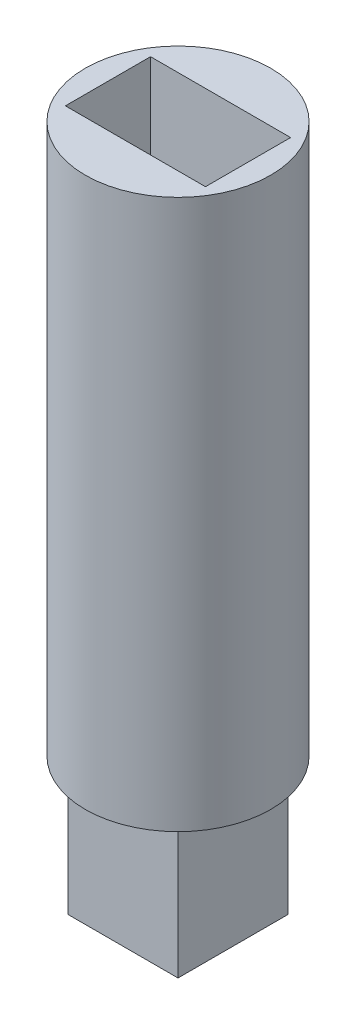
ISO-10303-21;
HEADER;
FILE_DESCRIPTION(('STEP AP214'),'2;1');
FILE_NAME('part.step','',(''),(''),'','','');
FILE_SCHEMA(('AUTOMOTIVE_DESIGN { 1 0 10303 214 1 1 1 1 }'));
ENDSEC;
DATA;
#1=APPLICATION_CONTEXT('core data for automotive mechanical design processes');
#2=APPLICATION_PROTOCOL_DEFINITION('international standard','automotive_design',2000,#1);
#3=PRODUCT_CONTEXT('',#1,'mechanical');
#4=PRODUCT('Part','Part','',(#3));
#5=PRODUCT_RELATED_PRODUCT_CATEGORY('part','',(#4));
#6=PRODUCT_DEFINITION_FORMATION('','',#4);
#7=PRODUCT_DEFINITION_CONTEXT('part definition',#1,'design');
#8=PRODUCT_DEFINITION('design','',#6,#7);
#9=PRODUCT_DEFINITION_SHAPE('','',#8);
#10=(LENGTH_UNIT() NAMED_UNIT(*) SI_UNIT(.MILLI.,.METRE.));
#11=(NAMED_UNIT(*) PLANE_ANGLE_UNIT() SI_UNIT($,.RADIAN.));
#12=(NAMED_UNIT(*) SI_UNIT($,.STERADIAN.) SOLID_ANGLE_UNIT());
#13=UNCERTAINTY_MEASURE_WITH_UNIT(LENGTH_MEASURE(1.E-05),#10,'distance_accuracy_value','');
#14=(GEOMETRIC_REPRESENTATION_CONTEXT(3) GLOBAL_UNCERTAINTY_ASSIGNED_CONTEXT((#13)) GLOBAL_UNIT_ASSIGNED_CONTEXT((#10,
#11,#12)) REPRESENTATION_CONTEXT('',''));
#15=CARTESIAN_POINT('',(0.,0.,0.));
#16=DIRECTION('',(0.,0.,1.));
#17=DIRECTION('',(1.,0.,0.));
#18=AXIS2_PLACEMENT_3D('',#15,#16,#17);
#19=CARTESIAN_POINT('',(0.,0.,0.));
#20=DIRECTION('',(0.,1.,0.));
#21=DIRECTION('',(0.,0.,1.));
#22=AXIS2_PLACEMENT_3D('',#19,#20,#21);
#23=PLANE('',#22);
#24=CARTESIAN_POINT('',(0.,0.,0.));
#25=DIRECTION('',(0.,1.,0.));
#26=DIRECTION('',(0.,0.,1.));
#27=AXIS2_PLACEMENT_3D('',#24,#25,#26);
#28=CIRCLE('',#27,3.375);
#29=CARTESIAN_POINT('',(0.,0.,3.375));
#30=VERTEX_POINT('',#29);
#31=EDGE_CURVE('E43',#30,#30,#28,.T.);
#32=ORIENTED_EDGE('',*,*,#31,.F.);
#33=EDGE_LOOP('',(#32));
#34=FACE_BOUND('',#33,.T.);
#35=DIRECTION('',(0.,0.,1.));
#36=VECTOR('',#35,1.);
#37=CARTESIAN_POINT('',(2.,0.,2.));
#38=LINE('',#37,#36);
#39=CARTESIAN_POINT('',(2.,0.,-2.));
#40=VERTEX_POINT('',#39);
#41=CARTESIAN_POINT('',(2.,0.,2.));
#42=VERTEX_POINT('',#41);
#43=EDGE_CURVE('E54',#40,#42,#38,.T.);
#44=ORIENTED_EDGE('',*,*,#43,.F.);
#45=DIRECTION('',(1.,0.,0.));
#46=VECTOR('',#45,1.);
#47=CARTESIAN_POINT('',(-2.,0.,-2.));
#48=LINE('',#47,#46);
#49=CARTESIAN_POINT('',(-2.,0.,-2.));
#50=VERTEX_POINT('',#49);
#51=EDGE_CURVE('E58',#50,#40,#48,.T.);
#52=ORIENTED_EDGE('',*,*,#51,.F.);
#53=DIRECTION('',(0.,0.,-1.));
#54=VECTOR('',#53,1.);
#55=CARTESIAN_POINT('',(-2.,0.,2.));
#56=LINE('',#55,#54);
#57=CARTESIAN_POINT('',(-2.,0.,2.));
#58=VERTEX_POINT('',#57);
#59=EDGE_CURVE('E267',#58,#50,#56,.T.);
#60=ORIENTED_EDGE('',*,*,#59,.F.);
#61=DIRECTION('',(-1.,0.,0.));
#62=VECTOR('',#61,1.);
#63=CARTESIAN_POINT('',(-2.,0.,2.));
#64=LINE('',#63,#62);
#65=EDGE_CURVE('E273',#42,#58,#64,.T.);
#66=ORIENTED_EDGE('',*,*,#65,.F.);
#67=EDGE_LOOP('',(#44,#52,#60,#66));
#68=FACE_BOUND('',#67,.T.);
#69=ADVANCED_FACE('F39',(#34,#68),#23,.F.);
#70=CARTESIAN_POINT('',(0.,20.,0.));
#71=DIRECTION('',(0.,-1.,0.));
#72=DIRECTION('',(0.,0.,-1.));
#73=AXIS2_PLACEMENT_3D('',#70,#71,#72);
#74=CYLINDRICAL_SURFACE('',#73,3.375);
#75=CARTESIAN_POINT('',(0.,20.,0.));
#76=DIRECTION('',(0.,1.,0.));
#77=DIRECTION('',(0.,0.,1.));
#78=AXIS2_PLACEMENT_3D('',#75,#76,#77);
#79=CIRCLE('',#78,3.375);
#80=CARTESIAN_POINT('',(0.,20.,3.375));
#81=VERTEX_POINT('',#80);
#82=EDGE_CURVE('E11',#81,#81,#79,.T.);
#83=ORIENTED_EDGE('',*,*,#82,.F.);
#84=EDGE_LOOP('',(#83));
#85=FACE_BOUND('',#84,.T.);
#86=ORIENTED_EDGE('',*,*,#31,.T.);
#87=EDGE_LOOP('',(#86));
#88=FACE_BOUND('',#87,.T.);
#89=ADVANCED_FACE('F41',(#85,#88),#74,.T.);
#90=CARTESIAN_POINT('',(0.,20.,0.));
#91=DIRECTION('',(0.,1.,0.));
#92=DIRECTION('',(0.,0.,1.));
#93=AXIS2_PLACEMENT_3D('',#90,#91,#92);
#94=PLANE('',#93);
#95=DIRECTION('',(0.,0.,-1.));
#96=VECTOR('',#95,1.);
#97=CARTESIAN_POINT('',(2.55,20.,-1.55));
#98=LINE('',#97,#96);
#99=CARTESIAN_POINT('',(2.55,20.,1.55));
#100=VERTEX_POINT('',#99);
#101=CARTESIAN_POINT('',(2.55,20.,-1.55));
#102=VERTEX_POINT('',#101);
#103=EDGE_CURVE('E124',#100,#102,#98,.T.);
#104=ORIENTED_EDGE('',*,*,#103,.F.);
#105=DIRECTION('',(1.,0.,0.));
#106=VECTOR('',#105,1.);
#107=CARTESIAN_POINT('',(-2.55,20.,1.55));
#108=LINE('',#107,#106);
#109=CARTESIAN_POINT('',(-2.55,20.,1.55));
#110=VERTEX_POINT('',#109);
#111=EDGE_CURVE('E136',#110,#100,#108,.T.);
#112=ORIENTED_EDGE('',*,*,#111,.F.);
#113=DIRECTION('',(0.,0.,1.));
#114=VECTOR('',#113,1.);
#115=CARTESIAN_POINT('',(-2.55,20.,-1.55));
#116=LINE('',#115,#114);
#117=CARTESIAN_POINT('',(-2.55,20.,-1.55));
#118=VERTEX_POINT('',#117);
#119=EDGE_CURVE('E148',#118,#110,#116,.T.);
#120=ORIENTED_EDGE('',*,*,#119,.F.);
#121=DIRECTION('',(-1.,0.,0.));
#122=VECTOR('',#121,1.);
#123=CARTESIAN_POINT('',(-2.55,20.,-1.55));
#124=LINE('',#123,#122);
#125=EDGE_CURVE('E126',#102,#118,#124,.T.);
#126=ORIENTED_EDGE('',*,*,#125,.F.);
#127=EDGE_LOOP('',(#104,#112,#120,#126));
#128=FACE_BOUND('',#127,.T.);
#129=ORIENTED_EDGE('',*,*,#82,.T.);
#130=EDGE_LOOP('',(#129));
#131=FACE_BOUND('',#130,.T.);
#132=ADVANCED_FACE('F169',(#128,#131),#94,.T.);
#133=CARTESIAN_POINT('',(2.55,14.,-1.55));
#134=DIRECTION('',(1.,0.,0.));
#135=DIRECTION('',(0.,0.,-1.));
#136=AXIS2_PLACEMENT_3D('',#133,#134,#135);
#137=PLANE('',#136);
#138=ORIENTED_EDGE('',*,*,#103,.T.);
#139=DIRECTION('',(0.,1.,0.));
#140=VECTOR('',#139,1.);
#141=CARTESIAN_POINT('',(2.55,14.,-1.55));
#142=LINE('',#141,#140);
#143=CARTESIAN_POINT('',(2.55,14.,-1.55));
#144=VERTEX_POINT('',#143);
#145=EDGE_CURVE('E144',#144,#102,#142,.T.);
#146=ORIENTED_EDGE('',*,*,#145,.F.);
#147=DIRECTION('',(0.,0.,-1.));
#148=VECTOR('',#147,1.);
#149=CARTESIAN_POINT('',(2.55,14.,-1.55));
#150=LINE('',#149,#148);
#151=CARTESIAN_POINT('',(2.55,14.,1.55));
#152=VERTEX_POINT('',#151);
#153=EDGE_CURVE('E132',#152,#144,#150,.T.);
#154=ORIENTED_EDGE('',*,*,#153,.F.);
#155=DIRECTION('',(0.,1.,0.));
#156=VECTOR('',#155,1.);
#157=CARTESIAN_POINT('',(2.55,14.,1.55));
#158=LINE('',#157,#156);
#159=EDGE_CURVE('E153',#152,#100,#158,.T.);
#160=ORIENTED_EDGE('',*,*,#159,.T.);
#161=EDGE_LOOP('',(#138,#146,#154,#160));
#162=FACE_BOUND('',#161,.T.);
#163=ADVANCED_FACE('F178',(#162),#137,.F.);
#164=CARTESIAN_POINT('',(-2.55,14.,1.55));
#165=DIRECTION('',(0.,0.,1.));
#166=DIRECTION('',(1.,0.,0.));
#167=AXIS2_PLACEMENT_3D('',#164,#165,#166);
#168=PLANE('',#167);
#169=ORIENTED_EDGE('',*,*,#111,.T.);
#170=ORIENTED_EDGE('',*,*,#159,.F.);
#171=DIRECTION('',(1.,0.,0.));
#172=VECTOR('',#171,1.);
#173=CARTESIAN_POINT('',(-2.55,14.,1.55));
#174=LINE('',#173,#172);
#175=CARTESIAN_POINT('',(-2.55,14.,1.55));
#176=VERTEX_POINT('',#175);
#177=EDGE_CURVE('E142',#176,#152,#174,.T.);
#178=ORIENTED_EDGE('',*,*,#177,.F.);
#179=DIRECTION('',(0.,1.,0.));
#180=VECTOR('',#179,1.);
#181=CARTESIAN_POINT('',(-2.55,14.,1.55));
#182=LINE('',#181,#180);
#183=EDGE_CURVE('E155',#176,#110,#182,.T.);
#184=ORIENTED_EDGE('',*,*,#183,.T.);
#185=EDGE_LOOP('',(#169,#170,#178,#184));
#186=FACE_BOUND('',#185,.T.);
#187=ADVANCED_FACE('F180',(#186),#168,.F.);
#188=CARTESIAN_POINT('',(-2.55,14.,-1.55));
#189=DIRECTION('',(-1.,0.,0.));
#190=DIRECTION('',(0.,0.,1.));
#191=AXIS2_PLACEMENT_3D('',#188,#189,#190);
#192=PLANE('',#191);
#193=ORIENTED_EDGE('',*,*,#119,.T.);
#194=ORIENTED_EDGE('',*,*,#183,.F.);
#195=DIRECTION('',(0.,0.,1.));
#196=VECTOR('',#195,1.);
#197=CARTESIAN_POINT('',(-2.55,14.,-1.55));
#198=LINE('',#197,#196);
#199=CARTESIAN_POINT('',(-2.55,14.,-1.55));
#200=VERTEX_POINT('',#199);
#201=EDGE_CURVE('E139',#200,#176,#198,.T.);
#202=ORIENTED_EDGE('',*,*,#201,.F.);
#203=DIRECTION('',(0.,1.,0.));
#204=VECTOR('',#203,1.);
#205=CARTESIAN_POINT('',(-2.55,14.,-1.55));
#206=LINE('',#205,#204);
#207=EDGE_CURVE('E157',#200,#118,#206,.T.);
#208=ORIENTED_EDGE('',*,*,#207,.T.);
#209=EDGE_LOOP('',(#193,#194,#202,#208));
#210=FACE_BOUND('',#209,.T.);
#211=ADVANCED_FACE('F173',(#210),#192,.F.);
#212=CARTESIAN_POINT('',(-2.55,14.,-1.55));
#213=DIRECTION('',(0.,0.,-1.));
#214=DIRECTION('',(-1.,0.,0.));
#215=AXIS2_PLACEMENT_3D('',#212,#213,#214);
#216=PLANE('',#215);
#217=ORIENTED_EDGE('',*,*,#125,.T.);
#218=ORIENTED_EDGE('',*,*,#207,.F.);
#219=DIRECTION('',(-1.,0.,0.));
#220=VECTOR('',#219,1.);
#221=CARTESIAN_POINT('',(-2.55,14.,-1.55));
#222=LINE('',#221,#220);
#223=EDGE_CURVE('E135',#144,#200,#222,.T.);
#224=ORIENTED_EDGE('',*,*,#223,.F.);
#225=ORIENTED_EDGE('',*,*,#145,.T.);
#226=EDGE_LOOP('',(#217,#218,#224,#225));
#227=FACE_BOUND('',#226,.T.);
#228=ADVANCED_FACE('F163',(#227),#216,.F.);
#229=CARTESIAN_POINT('',(0.,14.,0.));
#230=DIRECTION('',(0.,1.,0.));
#231=DIRECTION('',(0.,0.,1.));
#232=AXIS2_PLACEMENT_3D('',#229,#230,#231);
#233=PLANE('',#232);
#234=ORIENTED_EDGE('',*,*,#153,.T.);
#235=ORIENTED_EDGE('',*,*,#223,.T.);
#236=ORIENTED_EDGE('',*,*,#201,.T.);
#237=ORIENTED_EDGE('',*,*,#177,.T.);
#238=EDGE_LOOP('',(#234,#235,#236,#237));
#239=FACE_BOUND('',#238,.T.);
#240=ADVANCED_FACE('F177',(#239),#233,.T.);
#241=CARTESIAN_POINT('',(2.,-5.,2.));
#242=DIRECTION('',(-1.,0.,0.));
#243=DIRECTION('',(0.,0.,1.));
#244=AXIS2_PLACEMENT_3D('',#241,#242,#243);
#245=PLANE('',#244);
#246=ORIENTED_EDGE('',*,*,#43,.T.);
#247=DIRECTION('',(0.,1.,0.));
#248=VECTOR('',#247,1.);
#249=CARTESIAN_POINT('',(2.,-5.,2.));
#250=LINE('',#249,#248);
#251=CARTESIAN_POINT('',(2.,-5.,2.));
#252=VERTEX_POINT('',#251);
#253=EDGE_CURVE('E107',#252,#42,#250,.T.);
#254=ORIENTED_EDGE('',*,*,#253,.F.);
#255=DIRECTION('',(0.,0.,1.));
#256=VECTOR('',#255,1.);
#257=CARTESIAN_POINT('',(2.,-5.,2.));
#258=LINE('',#257,#256);
#259=CARTESIAN_POINT('',(2.,-5.,-2.));
#260=VERTEX_POINT('',#259);
#261=EDGE_CURVE('E113',#260,#252,#258,.T.);
#262=ORIENTED_EDGE('',*,*,#261,.F.);
#263=DIRECTION('',(0.,1.,0.));
#264=VECTOR('',#263,1.);
#265=CARTESIAN_POINT('',(2.,-5.,-2.));
#266=LINE('',#265,#264);
#267=EDGE_CURVE('E265',#260,#40,#266,.T.);
#268=ORIENTED_EDGE('',*,*,#267,.T.);
#269=EDGE_LOOP('',(#246,#254,#262,#268));
#270=FACE_BOUND('',#269,.T.);
#271=ADVANCED_FACE('F123',(#270),#245,.F.);
#272=CARTESIAN_POINT('',(-2.,-5.,2.));
#273=DIRECTION('',(0.,0.,-1.));
#274=DIRECTION('',(-1.,0.,0.));
#275=AXIS2_PLACEMENT_3D('',#272,#273,#274);
#276=PLANE('',#275);
#277=ORIENTED_EDGE('',*,*,#65,.T.);
#278=DIRECTION('',(0.,1.,0.));
#279=VECTOR('',#278,1.);
#280=CARTESIAN_POINT('',(-2.,-5.,2.));
#281=LINE('',#280,#279);
#282=CARTESIAN_POINT('',(-2.,-5.,2.));
#283=VERTEX_POINT('',#282);
#284=EDGE_CURVE('E109',#283,#58,#281,.T.);
#285=ORIENTED_EDGE('',*,*,#284,.F.);
#286=DIRECTION('',(-1.,0.,0.));
#287=VECTOR('',#286,1.);
#288=CARTESIAN_POINT('',(-2.,-5.,2.));
#289=LINE('',#288,#287);
#290=EDGE_CURVE('E102',#252,#283,#289,.T.);
#291=ORIENTED_EDGE('',*,*,#290,.F.);
#292=ORIENTED_EDGE('',*,*,#253,.T.);
#293=EDGE_LOOP('',(#277,#285,#291,#292));
#294=FACE_BOUND('',#293,.T.);
#295=ADVANCED_FACE('F105',(#294),#276,.F.);
#296=CARTESIAN_POINT('',(-2.,-5.,2.));
#297=DIRECTION('',(1.,0.,0.));
#298=DIRECTION('',(0.,0.,-1.));
#299=AXIS2_PLACEMENT_3D('',#296,#297,#298);
#300=PLANE('',#299);
#301=ORIENTED_EDGE('',*,*,#59,.T.);
#302=DIRECTION('',(0.,1.,0.));
#303=VECTOR('',#302,1.);
#304=CARTESIAN_POINT('',(-2.,-5.,-2.));
#305=LINE('',#304,#303);
#306=CARTESIAN_POINT('',(-2.,-5.,-2.));
#307=VERTEX_POINT('',#306);
#308=EDGE_CURVE('E128',#307,#50,#305,.T.);
#309=ORIENTED_EDGE('',*,*,#308,.F.);
#310=DIRECTION('',(0.,0.,-1.));
#311=VECTOR('',#310,1.);
#312=CARTESIAN_POINT('',(-2.,-5.,2.));
#313=LINE('',#312,#311);
#314=EDGE_CURVE('E112',#283,#307,#313,.T.);
#315=ORIENTED_EDGE('',*,*,#314,.F.);
#316=ORIENTED_EDGE('',*,*,#284,.T.);
#317=EDGE_LOOP('',(#301,#309,#315,#316));
#318=FACE_BOUND('',#317,.T.);
#319=ADVANCED_FACE('F211',(#318),#300,.F.);
#320=CARTESIAN_POINT('',(-2.,-5.,-2.));
#321=DIRECTION('',(0.,0.,1.));
#322=DIRECTION('',(1.,0.,0.));
#323=AXIS2_PLACEMENT_3D('',#320,#321,#322);
#324=PLANE('',#323);
#325=ORIENTED_EDGE('',*,*,#51,.T.);
#326=ORIENTED_EDGE('',*,*,#267,.F.);
#327=DIRECTION('',(1.,0.,0.));
#328=VECTOR('',#327,1.);
#329=CARTESIAN_POINT('',(-2.,-5.,-2.));
#330=LINE('',#329,#328);
#331=EDGE_CURVE('E118',#307,#260,#330,.T.);
#332=ORIENTED_EDGE('',*,*,#331,.F.);
#333=ORIENTED_EDGE('',*,*,#308,.T.);
#334=EDGE_LOOP('',(#325,#326,#332,#333));
#335=FACE_BOUND('',#334,.T.);
#336=ADVANCED_FACE('F214',(#335),#324,.F.);
#337=CARTESIAN_POINT('',(0.,-5.,0.));
#338=DIRECTION('',(0.,-1.,0.));
#339=DIRECTION('',(0.,0.,-1.));
#340=AXIS2_PLACEMENT_3D('',#337,#338,#339);
#341=PLANE('',#340);
#342=ORIENTED_EDGE('',*,*,#261,.T.);
#343=ORIENTED_EDGE('',*,*,#290,.T.);
#344=ORIENTED_EDGE('',*,*,#314,.T.);
#345=ORIENTED_EDGE('',*,*,#331,.T.);
#346=EDGE_LOOP('',(#342,#343,#344,#345));
#347=FACE_BOUND('',#346,.T.);
#348=ADVANCED_FACE('F116',(#347),#341,.T.);
#349=CLOSED_SHELL('',(#69,#89,#132,#163,#187,#211,#228,#240,#271,#295,#319,#336,#348));
#350=MANIFOLD_SOLID_BREP('B2',#349);
#351=ADVANCED_BREP_SHAPE_REPRESENTATION('',(#18,#350),#14);
#352=SHAPE_DEFINITION_REPRESENTATION(#9,#351);
ENDSEC;
END-ISO-10303-21;
